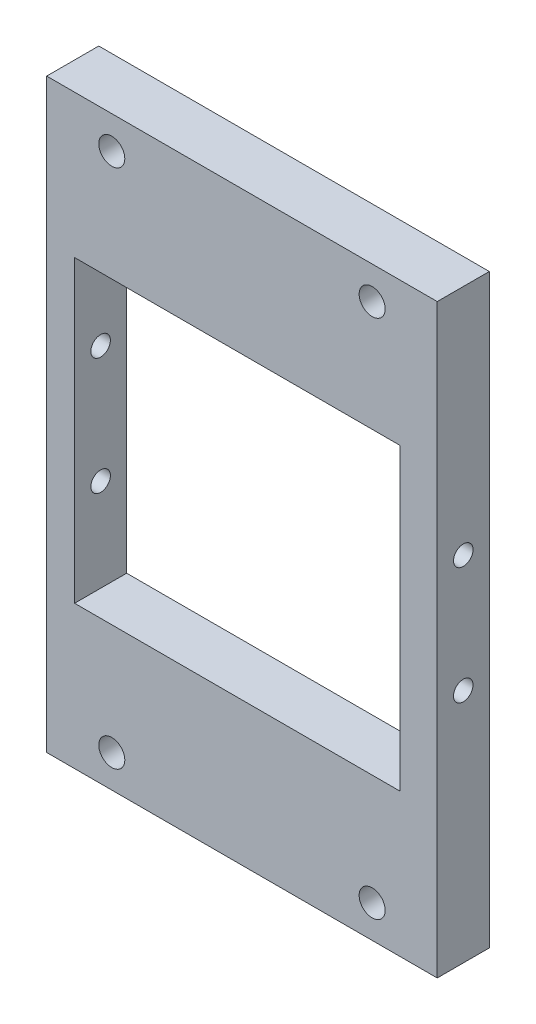
ISO-10303-21;
HEADER;
FILE_DESCRIPTION(('STEP AP214'),'2;1');
FILE_NAME('part.step','',(''),(''),'','','');
FILE_SCHEMA(('AUTOMOTIVE_DESIGN { 1 0 10303 214 1 1 1 1 }'));
ENDSEC;
DATA;
#1=APPLICATION_CONTEXT('core data for automotive mechanical design processes');
#2=APPLICATION_PROTOCOL_DEFINITION('international standard','automotive_design',2000,#1);
#3=PRODUCT_CONTEXT('',#1,'mechanical');
#4=PRODUCT('Part','Part','',(#3));
#5=PRODUCT_RELATED_PRODUCT_CATEGORY('part','',(#4));
#6=PRODUCT_DEFINITION_FORMATION('','',#4);
#7=PRODUCT_DEFINITION_CONTEXT('part definition',#1,'design');
#8=PRODUCT_DEFINITION('design','',#6,#7);
#9=PRODUCT_DEFINITION_SHAPE('','',#8);
#10=(LENGTH_UNIT() NAMED_UNIT(*) SI_UNIT(.MILLI.,.METRE.));
#11=(NAMED_UNIT(*) PLANE_ANGLE_UNIT() SI_UNIT($,.RADIAN.));
#12=(NAMED_UNIT(*) SI_UNIT($,.STERADIAN.) SOLID_ANGLE_UNIT());
#13=UNCERTAINTY_MEASURE_WITH_UNIT(LENGTH_MEASURE(1.E-05),#10,'distance_accuracy_value','');
#14=(GEOMETRIC_REPRESENTATION_CONTEXT(3) GLOBAL_UNCERTAINTY_ASSIGNED_CONTEXT((#13)) GLOBAL_UNIT_ASSIGNED_CONTEXT((#10,
#11,#12)) REPRESENTATION_CONTEXT('',''));
#15=CARTESIAN_POINT('',(0.,0.,0.));
#16=DIRECTION('',(0.,0.,1.));
#17=DIRECTION('',(1.,0.,0.));
#18=AXIS2_PLACEMENT_3D('',#15,#16,#17);
#19=CARTESIAN_POINT('',(-25.2870834420141,-45.,8.));
#20=DIRECTION('',(-1.,0.,0.));
#21=DIRECTION('',(0.,0.,1.));
#22=AXIS2_PLACEMENT_3D('',#19,#20,#21);
#23=PLANE('',#22);
#24=CARTESIAN_POINT('',(-25.2870834420141,9.25255391231961,4.));
#25=DIRECTION('',(-1.,0.,0.));
#26=DIRECTION('',(0.,0.,1.));
#27=AXIS2_PLACEMENT_3D('',#24,#25,#26);
#28=CIRCLE('',#27,1.5);
#29=CARTESIAN_POINT('',(-25.2870834420141,9.25255391231961,5.5));
#30=VERTEX_POINT('',#29);
#31=EDGE_CURVE('E245',#30,#30,#28,.T.);
#32=ORIENTED_EDGE('',*,*,#31,.T.);
#33=EDGE_LOOP('',(#32));
#34=FACE_BOUND('',#33,.T.);
#35=CARTESIAN_POINT('',(-25.2870834420141,-8.74744608768039,4.));
#36=DIRECTION('',(-1.,0.,0.));
#37=DIRECTION('',(0.,0.,1.));
#38=AXIS2_PLACEMENT_3D('',#35,#36,#37);
#39=CIRCLE('',#38,1.5);
#40=CARTESIAN_POINT('',(-25.2870834420141,-8.74744608768039,5.5));
#41=VERTEX_POINT('',#40);
#42=EDGE_CURVE('E161',#41,#41,#39,.T.);
#43=ORIENTED_EDGE('',*,*,#42,.T.);
#44=EDGE_LOOP('',(#43));
#45=FACE_BOUND('',#44,.T.);
#46=DIRECTION('',(0.,1.,0.));
#47=VECTOR('',#46,1.);
#48=CARTESIAN_POINT('',(-25.2870834420141,-45.,0.));
#49=LINE('',#48,#47);
#50=CARTESIAN_POINT('',(-25.2870834420141,-45.,0.));
#51=VERTEX_POINT('',#50);
#52=CARTESIAN_POINT('',(-25.2870834420141,45.,0.));
#53=VERTEX_POINT('',#52);
#54=EDGE_CURVE('E130',#51,#53,#49,.T.);
#55=ORIENTED_EDGE('',*,*,#54,.T.);
#56=DIRECTION('',(0.,0.,-1.));
#57=VECTOR('',#56,1.);
#58=CARTESIAN_POINT('',(-25.2870834420141,45.,8.));
#59=LINE('',#58,#57);
#60=CARTESIAN_POINT('',(-25.2870834420141,45.,8.));
#61=VERTEX_POINT('',#60);
#62=EDGE_CURVE('E11',#61,#53,#59,.T.);
#63=ORIENTED_EDGE('',*,*,#62,.F.);
#64=DIRECTION('',(0.,1.,0.));
#65=VECTOR('',#64,1.);
#66=CARTESIAN_POINT('',(-25.2870834420141,-45.,8.));
#67=LINE('',#66,#65);
#68=CARTESIAN_POINT('',(-25.2870834420141,-45.,8.));
#69=VERTEX_POINT('',#68);
#70=EDGE_CURVE('E132',#69,#61,#67,.T.);
#71=ORIENTED_EDGE('',*,*,#70,.F.);
#72=DIRECTION('',(0.,0.,-1.));
#73=VECTOR('',#72,1.);
#74=CARTESIAN_POINT('',(-25.2870834420141,-45.,8.));
#75=LINE('',#74,#73);
#76=EDGE_CURVE('E144',#69,#51,#75,.T.);
#77=ORIENTED_EDGE('',*,*,#76,.T.);
#78=EDGE_LOOP('',(#55,#63,#71,#77));
#79=FACE_BOUND('',#78,.T.);
#80=ADVANCED_FACE('F32',(#34,#45,#79),#23,.F.);
#81=CARTESIAN_POINT('',(-25.2870834420141,45.,8.));
#82=DIRECTION('',(0.,-1.,0.));
#83=DIRECTION('',(1.,0.,0.));
#84=AXIS2_PLACEMENT_3D('',#81,#82,#83);
#85=PLANE('',#84);
#86=DIRECTION('',(-1.,0.,0.));
#87=VECTOR('',#86,1.);
#88=CARTESIAN_POINT('',(-25.2870834420141,45.,0.));
#89=LINE('',#88,#87);
#90=CARTESIAN_POINT('',(-85.2870834420141,45.,0.));
#91=VERTEX_POINT('',#90);
#92=EDGE_CURVE('E147',#53,#91,#89,.T.);
#93=ORIENTED_EDGE('',*,*,#92,.T.);
#94=DIRECTION('',(0.,0.,-1.));
#95=VECTOR('',#94,1.);
#96=CARTESIAN_POINT('',(-85.2870834420141,45.,8.));
#97=LINE('',#96,#95);
#98=CARTESIAN_POINT('',(-85.2870834420141,45.,8.));
#99=VERTEX_POINT('',#98);
#100=EDGE_CURVE('E40',#99,#91,#97,.T.);
#101=ORIENTED_EDGE('',*,*,#100,.F.);
#102=DIRECTION('',(-1.,0.,0.));
#103=VECTOR('',#102,1.);
#104=CARTESIAN_POINT('',(-25.2870834420141,45.,8.));
#105=LINE('',#104,#103);
#106=EDGE_CURVE('E135',#61,#99,#105,.T.);
#107=ORIENTED_EDGE('',*,*,#106,.F.);
#108=ORIENTED_EDGE('',*,*,#62,.T.);
#109=EDGE_LOOP('',(#93,#101,#107,#108));
#110=FACE_BOUND('',#109,.T.);
#111=ADVANCED_FACE('F228',(#110),#85,.F.);
#112=CARTESIAN_POINT('',(-85.2870834420141,-45.,8.));
#113=DIRECTION('',(-1.,0.,0.));
#114=DIRECTION('',(0.,0.,1.));
#115=AXIS2_PLACEMENT_3D('',#112,#113,#114);
#116=PLANE('',#115);
#117=CARTESIAN_POINT('',(-85.2870834420141,9.25255391231961,4.));
#118=DIRECTION('',(-1.,0.,0.));
#119=DIRECTION('',(0.,0.,1.));
#120=AXIS2_PLACEMENT_3D('',#117,#118,#119);
#121=CIRCLE('',#120,1.5);
#122=CARTESIAN_POINT('',(-85.2870834420141,9.25255391231961,5.5));
#123=VERTEX_POINT('',#122);
#124=EDGE_CURVE('E247',#123,#123,#121,.T.);
#125=ORIENTED_EDGE('',*,*,#124,.F.);
#126=EDGE_LOOP('',(#125));
#127=FACE_BOUND('',#126,.T.);
#128=CARTESIAN_POINT('',(-85.2870834420141,-8.74744608768039,4.));
#129=DIRECTION('',(-1.,0.,0.));
#130=DIRECTION('',(0.,0.,1.));
#131=AXIS2_PLACEMENT_3D('',#128,#129,#130);
#132=CIRCLE('',#131,1.5);
#133=CARTESIAN_POINT('',(-85.2870834420141,-8.74744608768039,5.5));
#134=VERTEX_POINT('',#133);
#135=EDGE_CURVE('E168',#134,#134,#132,.T.);
#136=ORIENTED_EDGE('',*,*,#135,.F.);
#137=EDGE_LOOP('',(#136));
#138=FACE_BOUND('',#137,.T.);
#139=DIRECTION('',(0.,1.,0.));
#140=VECTOR('',#139,1.);
#141=CARTESIAN_POINT('',(-85.2870834420141,-45.,0.));
#142=LINE('',#141,#140);
#143=CARTESIAN_POINT('',(-85.2870834420141,-45.,0.));
#144=VERTEX_POINT('',#143);
#145=EDGE_CURVE('E150',#144,#91,#142,.T.);
#146=ORIENTED_EDGE('',*,*,#145,.F.);
#147=DIRECTION('',(0.,0.,-1.));
#148=VECTOR('',#147,1.);
#149=CARTESIAN_POINT('',(-85.2870834420141,-45.,8.));
#150=LINE('',#149,#148);
#151=CARTESIAN_POINT('',(-85.2870834420141,-45.,8.));
#152=VERTEX_POINT('',#151);
#153=EDGE_CURVE('E156',#152,#144,#150,.T.);
#154=ORIENTED_EDGE('',*,*,#153,.F.);
#155=DIRECTION('',(0.,1.,0.));
#156=VECTOR('',#155,1.);
#157=CARTESIAN_POINT('',(-85.2870834420141,-45.,8.));
#158=LINE('',#157,#156);
#159=EDGE_CURVE('E138',#152,#99,#158,.T.);
#160=ORIENTED_EDGE('',*,*,#159,.T.);
#161=ORIENTED_EDGE('',*,*,#100,.T.);
#162=EDGE_LOOP('',(#146,#154,#160,#161));
#163=FACE_BOUND('',#162,.T.);
#164=ADVANCED_FACE('F225',(#127,#138,#163),#116,.T.);
#165=CARTESIAN_POINT('',(-25.2870834420141,-45.,8.));
#166=DIRECTION('',(0.,-1.,0.));
#167=DIRECTION('',(1.,0.,0.));
#168=AXIS2_PLACEMENT_3D('',#165,#166,#167);
#169=PLANE('',#168);
#170=DIRECTION('',(-1.,0.,0.));
#171=VECTOR('',#170,1.);
#172=CARTESIAN_POINT('',(-25.2870834420141,-45.,0.));
#173=LINE('',#172,#171);
#174=EDGE_CURVE('E136',#51,#144,#173,.T.);
#175=ORIENTED_EDGE('',*,*,#174,.F.);
#176=ORIENTED_EDGE('',*,*,#76,.F.);
#177=DIRECTION('',(-1.,0.,0.));
#178=VECTOR('',#177,1.);
#179=CARTESIAN_POINT('',(-25.2870834420141,-45.,8.));
#180=LINE('',#179,#178);
#181=EDGE_CURVE('E141',#69,#152,#180,.T.);
#182=ORIENTED_EDGE('',*,*,#181,.T.);
#183=ORIENTED_EDGE('',*,*,#153,.T.);
#184=EDGE_LOOP('',(#175,#176,#182,#183));
#185=FACE_BOUND('',#184,.T.);
#186=ADVANCED_FACE('F219',(#185),#169,.T.);
#187=CARTESIAN_POINT('',(0.,0.,8.));
#188=DIRECTION('',(0.,0.,1.));
#189=DIRECTION('',(1.,0.,0.));
#190=AXIS2_PLACEMENT_3D('',#187,#188,#189);
#191=PLANE('',#190);
#192=CARTESIAN_POINT('',(-35.2870834420141,40.,8.));
#193=DIRECTION('',(0.,0.,-1.));
#194=DIRECTION('',(1.,0.,0.));
#195=AXIS2_PLACEMENT_3D('',#192,#193,#194);
#196=CIRCLE('',#195,2.);
#197=CARTESIAN_POINT('',(-33.2870834420141,40.,8.));
#198=VERTEX_POINT('',#197);
#199=EDGE_CURVE('E165',#198,#198,#196,.T.);
#200=ORIENTED_EDGE('',*,*,#199,.T.);
#201=EDGE_LOOP('',(#200));
#202=FACE_BOUND('',#201,.T.);
#203=CARTESIAN_POINT('',(-75.2870834420141,40.,8.));
#204=DIRECTION('',(0.,0.,-1.));
#205=DIRECTION('',(1.,0.,0.));
#206=AXIS2_PLACEMENT_3D('',#203,#204,#205);
#207=CIRCLE('',#206,2.);
#208=CARTESIAN_POINT('',(-73.2870834420141,40.,8.));
#209=VERTEX_POINT('',#208);
#210=EDGE_CURVE('E181',#209,#209,#207,.T.);
#211=ORIENTED_EDGE('',*,*,#210,.T.);
#212=EDGE_LOOP('',(#211));
#213=FACE_BOUND('',#212,.T.);
#214=CARTESIAN_POINT('',(-35.2870834420141,-40.,8.));
#215=DIRECTION('',(0.,0.,1.));
#216=DIRECTION('',(1.,0.,0.));
#217=AXIS2_PLACEMENT_3D('',#214,#215,#216);
#218=CIRCLE('',#217,2.);
#219=CARTESIAN_POINT('',(-33.2870834420141,-40.,8.));
#220=VERTEX_POINT('',#219);
#221=EDGE_CURVE('E187',#220,#220,#218,.T.);
#222=ORIENTED_EDGE('',*,*,#221,.F.);
#223=EDGE_LOOP('',(#222));
#224=FACE_BOUND('',#223,.T.);
#225=CARTESIAN_POINT('',(-75.2870834420141,-40.,8.));
#226=DIRECTION('',(0.,0.,1.));
#227=DIRECTION('',(1.,0.,0.));
#228=AXIS2_PLACEMENT_3D('',#225,#226,#227);
#229=CIRCLE('',#228,2.);
#230=CARTESIAN_POINT('',(-73.2870834420141,-40.,8.));
#231=VERTEX_POINT('',#230);
#232=EDGE_CURVE('E193',#231,#231,#229,.T.);
#233=ORIENTED_EDGE('',*,*,#232,.F.);
#234=EDGE_LOOP('',(#233));
#235=FACE_BOUND('',#234,.T.);
#236=DIRECTION('',(0.,-1.,0.));
#237=VECTOR('',#236,1.);
#238=CARTESIAN_POINT('',(-81.,17.,8.));
#239=LINE('',#238,#237);
#240=CARTESIAN_POINT('',(-81.,23.,8.));
#241=VERTEX_POINT('',#240);
#242=CARTESIAN_POINT('',(-81.,-23.,8.));
#243=VERTEX_POINT('',#242);
#244=EDGE_CURVE('E48',#241,#243,#239,.T.);
#245=ORIENTED_EDGE('',*,*,#244,.F.);
#246=DIRECTION('',(-1.,0.,0.));
#247=VECTOR('',#246,1.);
#248=CARTESIAN_POINT('',(-31.,23.,8.));
#249=LINE('',#248,#247);
#250=CARTESIAN_POINT('',(-31.,23.,8.));
#251=VERTEX_POINT('',#250);
#252=EDGE_CURVE('E118',#251,#241,#249,.T.);
#253=ORIENTED_EDGE('',*,*,#252,.F.);
#254=DIRECTION('',(0.,1.,0.));
#255=VECTOR('',#254,1.);
#256=CARTESIAN_POINT('',(-31.,17.,8.));
#257=LINE('',#256,#255);
#258=CARTESIAN_POINT('',(-31.,-23.,8.));
#259=VERTEX_POINT('',#258);
#260=EDGE_CURVE('E101',#259,#251,#257,.T.);
#261=ORIENTED_EDGE('',*,*,#260,.F.);
#262=DIRECTION('',(1.,0.,0.));
#263=VECTOR('',#262,1.);
#264=CARTESIAN_POINT('',(-31.,-23.,8.));
#265=LINE('',#264,#263);
#266=EDGE_CURVE('E110',#243,#259,#265,.T.);
#267=ORIENTED_EDGE('',*,*,#266,.F.);
#268=EDGE_LOOP('',(#245,#253,#261,#267));
#269=FACE_BOUND('',#268,.T.);
#270=ORIENTED_EDGE('',*,*,#70,.T.);
#271=ORIENTED_EDGE('',*,*,#106,.T.);
#272=ORIENTED_EDGE('',*,*,#159,.F.);
#273=ORIENTED_EDGE('',*,*,#181,.F.);
#274=EDGE_LOOP('',(#270,#271,#272,#273));
#275=FACE_BOUND('',#274,.T.);
#276=ADVANCED_FACE('F115',(#202,#213,#224,#235,#269,#275),#191,.T.);
#277=CARTESIAN_POINT('',(0.,0.,0.));
#278=DIRECTION('',(0.,0.,1.));
#279=DIRECTION('',(1.,0.,0.));
#280=AXIS2_PLACEMENT_3D('',#277,#278,#279);
#281=PLANE('',#280);
#282=CARTESIAN_POINT('',(-35.2870834420141,40.,0.));
#283=DIRECTION('',(0.,0.,-1.));
#284=DIRECTION('',(1.,0.,0.));
#285=AXIS2_PLACEMENT_3D('',#282,#283,#284);
#286=CIRCLE('',#285,2.);
#287=CARTESIAN_POINT('',(-33.2870834420141,40.,0.));
#288=VERTEX_POINT('',#287);
#289=EDGE_CURVE('E178',#288,#288,#286,.T.);
#290=ORIENTED_EDGE('',*,*,#289,.F.);
#291=EDGE_LOOP('',(#290));
#292=FACE_BOUND('',#291,.T.);
#293=CARTESIAN_POINT('',(-75.2870834420141,40.,0.));
#294=DIRECTION('',(0.,0.,-1.));
#295=DIRECTION('',(1.,0.,0.));
#296=AXIS2_PLACEMENT_3D('',#293,#294,#295);
#297=CIRCLE('',#296,2.);
#298=CARTESIAN_POINT('',(-73.2870834420141,40.,0.));
#299=VERTEX_POINT('',#298);
#300=EDGE_CURVE('E184',#299,#299,#297,.T.);
#301=ORIENTED_EDGE('',*,*,#300,.F.);
#302=EDGE_LOOP('',(#301));
#303=FACE_BOUND('',#302,.T.);
#304=CARTESIAN_POINT('',(-35.2870834420141,-40.,0.));
#305=DIRECTION('',(0.,0.,1.));
#306=DIRECTION('',(1.,0.,0.));
#307=AXIS2_PLACEMENT_3D('',#304,#305,#306);
#308=CIRCLE('',#307,2.);
#309=CARTESIAN_POINT('',(-33.2870834420141,-40.,0.));
#310=VERTEX_POINT('',#309);
#311=EDGE_CURVE('E190',#310,#310,#308,.T.);
#312=ORIENTED_EDGE('',*,*,#311,.T.);
#313=EDGE_LOOP('',(#312));
#314=FACE_BOUND('',#313,.T.);
#315=CARTESIAN_POINT('',(-75.2870834420141,-40.,0.));
#316=DIRECTION('',(0.,0.,1.));
#317=DIRECTION('',(1.,0.,0.));
#318=AXIS2_PLACEMENT_3D('',#315,#316,#317);
#319=CIRCLE('',#318,2.);
#320=CARTESIAN_POINT('',(-73.2870834420141,-40.,0.));
#321=VERTEX_POINT('',#320);
#322=EDGE_CURVE('E113',#321,#321,#319,.T.);
#323=ORIENTED_EDGE('',*,*,#322,.T.);
#324=EDGE_LOOP('',(#323));
#325=FACE_BOUND('',#324,.T.);
#326=DIRECTION('',(1.,0.,0.));
#327=VECTOR('',#326,1.);
#328=CARTESIAN_POINT('',(-31.,23.,0.));
#329=LINE('',#328,#327);
#330=CARTESIAN_POINT('',(-81.,23.,0.));
#331=VERTEX_POINT('',#330);
#332=CARTESIAN_POINT('',(-31.,23.,0.));
#333=VERTEX_POINT('',#332);
#334=EDGE_CURVE('E201',#331,#333,#329,.T.);
#335=ORIENTED_EDGE('',*,*,#334,.F.);
#336=DIRECTION('',(0.,1.,0.));
#337=VECTOR('',#336,1.);
#338=CARTESIAN_POINT('',(-81.,17.,0.));
#339=LINE('',#338,#337);
#340=CARTESIAN_POINT('',(-81.,-23.,0.));
#341=VERTEX_POINT('',#340);
#342=EDGE_CURVE('E131',#341,#331,#339,.T.);
#343=ORIENTED_EDGE('',*,*,#342,.F.);
#344=DIRECTION('',(-1.,0.,0.));
#345=VECTOR('',#344,1.);
#346=CARTESIAN_POINT('',(-31.,-23.,0.));
#347=LINE('',#346,#345);
#348=CARTESIAN_POINT('',(-31.,-23.,0.));
#349=VERTEX_POINT('',#348);
#350=EDGE_CURVE('E128',#349,#341,#347,.T.);
#351=ORIENTED_EDGE('',*,*,#350,.F.);
#352=DIRECTION('',(0.,-1.,0.));
#353=VECTOR('',#352,1.);
#354=CARTESIAN_POINT('',(-31.,17.,0.));
#355=LINE('',#354,#353);
#356=EDGE_CURVE('E104',#333,#349,#355,.T.);
#357=ORIENTED_EDGE('',*,*,#356,.F.);
#358=EDGE_LOOP('',(#335,#343,#351,#357));
#359=FACE_BOUND('',#358,.T.);
#360=ORIENTED_EDGE('',*,*,#54,.F.);
#361=ORIENTED_EDGE('',*,*,#174,.T.);
#362=ORIENTED_EDGE('',*,*,#145,.T.);
#363=ORIENTED_EDGE('',*,*,#92,.F.);
#364=EDGE_LOOP('',(#360,#361,#362,#363));
#365=FACE_BOUND('',#364,.T.);
#366=ADVANCED_FACE('F209',(#292,#303,#314,#325,#359,#365),#281,.F.);
#367=CARTESIAN_POINT('',(-81.,17.,-67.9411510058521));
#368=DIRECTION('',(-1.,0.,0.));
#369=DIRECTION('',(0.,-1.,0.));
#370=AXIS2_PLACEMENT_3D('',#367,#368,#369);
#371=PLANE('',#370);
#372=CARTESIAN_POINT('',(-81.,9.25255391231961,4.));
#373=DIRECTION('',(-1.,0.,0.));
#374=DIRECTION('',(0.,-1.,0.));
#375=AXIS2_PLACEMENT_3D('',#372,#373,#374);
#376=CIRCLE('',#375,1.5);
#377=CARTESIAN_POINT('',(-81.,7.75255391231961,4.));
#378=VERTEX_POINT('',#377);
#379=EDGE_CURVE('E173',#378,#378,#376,.T.);
#380=ORIENTED_EDGE('',*,*,#379,.T.);
#381=EDGE_LOOP('',(#380));
#382=FACE_BOUND('',#381,.T.);
#383=CARTESIAN_POINT('',(-81.0000000000001,-8.74744608768039,4.));
#384=DIRECTION('',(-1.,0.,0.));
#385=DIRECTION('',(0.,-1.,0.));
#386=AXIS2_PLACEMENT_3D('',#383,#384,#385);
#387=CIRCLE('',#386,1.5);
#388=CARTESIAN_POINT('',(-81.0000000000001,-10.2474460876804,4.));
#389=VERTEX_POINT('',#388);
#390=EDGE_CURVE('E160',#389,#389,#387,.T.);
#391=ORIENTED_EDGE('',*,*,#390,.T.);
#392=EDGE_LOOP('',(#391));
#393=FACE_BOUND('',#392,.T.);
#394=ORIENTED_EDGE('',*,*,#342,.T.);
#395=DIRECTION('',(0.,0.,1.));
#396=VECTOR('',#395,1.);
#397=CARTESIAN_POINT('',(-81.,23.,-67.9411510058521));
#398=LINE('',#397,#396);
#399=EDGE_CURVE('E124',#331,#241,#398,.T.);
#400=ORIENTED_EDGE('',*,*,#399,.T.);
#401=ORIENTED_EDGE('',*,*,#244,.T.);
#402=DIRECTION('',(0.,0.,1.));
#403=VECTOR('',#402,1.);
#404=CARTESIAN_POINT('',(-81.,-23.,-67.9411510058521));
#405=LINE('',#404,#403);
#406=EDGE_CURVE('E107',#341,#243,#405,.T.);
#407=ORIENTED_EDGE('',*,*,#406,.F.);
#408=EDGE_LOOP('',(#394,#400,#401,#407));
#409=FACE_BOUND('',#408,.T.);
#410=ADVANCED_FACE('F204',(#382,#393,#409),#371,.F.);
#411=CARTESIAN_POINT('',(-31.,23.,-67.9411510058521));
#412=DIRECTION('',(0.,1.,0.));
#413=DIRECTION('',(0.,0.,1.));
#414=AXIS2_PLACEMENT_3D('',#411,#412,#413);
#415=PLANE('',#414);
#416=ORIENTED_EDGE('',*,*,#334,.T.);
#417=DIRECTION('',(0.,0.,1.));
#418=VECTOR('',#417,1.);
#419=CARTESIAN_POINT('',(-31.,23.,-67.9411510058521));
#420=LINE('',#419,#418);
#421=EDGE_CURVE('E106',#333,#251,#420,.T.);
#422=ORIENTED_EDGE('',*,*,#421,.T.);
#423=ORIENTED_EDGE('',*,*,#252,.T.);
#424=ORIENTED_EDGE('',*,*,#399,.F.);
#425=EDGE_LOOP('',(#416,#422,#423,#424));
#426=FACE_BOUND('',#425,.T.);
#427=ADVANCED_FACE('F208',(#426),#415,.F.);
#428=CARTESIAN_POINT('',(-31.,17.,-67.9411510058521));
#429=DIRECTION('',(1.,0.,0.));
#430=DIRECTION('',(0.,0.,-1.));
#431=AXIS2_PLACEMENT_3D('',#428,#429,#430);
#432=PLANE('',#431);
#433=CARTESIAN_POINT('',(-31.,9.25255391231961,4.));
#434=DIRECTION('',(1.,0.,0.));
#435=DIRECTION('',(0.,0.,-1.));
#436=AXIS2_PLACEMENT_3D('',#433,#434,#435);
#437=CIRCLE('',#436,1.5);
#438=CARTESIAN_POINT('',(-31.,9.25255391231961,2.5));
#439=VERTEX_POINT('',#438);
#440=EDGE_CURVE('E35',#439,#439,#437,.T.);
#441=ORIENTED_EDGE('',*,*,#440,.T.);
#442=EDGE_LOOP('',(#441));
#443=FACE_BOUND('',#442,.T.);
#444=CARTESIAN_POINT('',(-31.,-8.74744608768039,4.));
#445=DIRECTION('',(1.,0.,0.));
#446=DIRECTION('',(0.,0.,-1.));
#447=AXIS2_PLACEMENT_3D('',#444,#445,#446);
#448=CIRCLE('',#447,1.5);
#449=CARTESIAN_POINT('',(-31.,-8.74744608768039,2.5));
#450=VERTEX_POINT('',#449);
#451=EDGE_CURVE('E158',#450,#450,#448,.T.);
#452=ORIENTED_EDGE('',*,*,#451,.T.);
#453=EDGE_LOOP('',(#452));
#454=FACE_BOUND('',#453,.T.);
#455=ORIENTED_EDGE('',*,*,#356,.T.);
#456=DIRECTION('',(0.,0.,1.));
#457=VECTOR('',#456,1.);
#458=CARTESIAN_POINT('',(-31.,-23.,-67.9411510058521));
#459=LINE('',#458,#457);
#460=EDGE_CURVE('E56',#349,#259,#459,.T.);
#461=ORIENTED_EDGE('',*,*,#460,.T.);
#462=ORIENTED_EDGE('',*,*,#260,.T.);
#463=ORIENTED_EDGE('',*,*,#421,.F.);
#464=EDGE_LOOP('',(#455,#461,#462,#463));
#465=FACE_BOUND('',#464,.T.);
#466=ADVANCED_FACE('F98',(#443,#454,#465),#432,.F.);
#467=CARTESIAN_POINT('',(-31.,-23.,-67.9411510058521));
#468=DIRECTION('',(0.,-1.,0.));
#469=DIRECTION('',(0.,0.,-1.));
#470=AXIS2_PLACEMENT_3D('',#467,#468,#469);
#471=PLANE('',#470);
#472=ORIENTED_EDGE('',*,*,#350,.T.);
#473=ORIENTED_EDGE('',*,*,#406,.T.);
#474=ORIENTED_EDGE('',*,*,#266,.T.);
#475=ORIENTED_EDGE('',*,*,#460,.F.);
#476=EDGE_LOOP('',(#472,#473,#474,#475));
#477=FACE_BOUND('',#476,.T.);
#478=ADVANCED_FACE('F111',(#477),#471,.F.);
#479=CARTESIAN_POINT('',(-75.2870834420141,-40.,0.));
#480=DIRECTION('',(0.,0.,1.));
#481=DIRECTION('',(1.,0.,0.));
#482=AXIS2_PLACEMENT_3D('',#479,#480,#481);
#483=CYLINDRICAL_SURFACE('',#482,2.);
#484=ORIENTED_EDGE('',*,*,#322,.F.);
#485=EDGE_LOOP('',(#484));
#486=FACE_BOUND('',#485,.T.);
#487=ORIENTED_EDGE('',*,*,#232,.T.);
#488=EDGE_LOOP('',(#487));
#489=FACE_BOUND('',#488,.T.);
#490=ADVANCED_FACE('F278',(#486,#489),#483,.F.);
#491=CARTESIAN_POINT('',(-35.2870834420141,-40.,0.));
#492=DIRECTION('',(0.,0.,1.));
#493=DIRECTION('',(1.,0.,0.));
#494=AXIS2_PLACEMENT_3D('',#491,#492,#493);
#495=CYLINDRICAL_SURFACE('',#494,2.);
#496=ORIENTED_EDGE('',*,*,#311,.F.);
#497=EDGE_LOOP('',(#496));
#498=FACE_BOUND('',#497,.T.);
#499=ORIENTED_EDGE('',*,*,#221,.T.);
#500=EDGE_LOOP('',(#499));
#501=FACE_BOUND('',#500,.T.);
#502=ADVANCED_FACE('F287',(#498,#501),#495,.F.);
#503=CARTESIAN_POINT('',(-75.2870834420141,40.,0.));
#504=DIRECTION('',(0.,0.,1.));
#505=DIRECTION('',(1.,0.,0.));
#506=AXIS2_PLACEMENT_3D('',#503,#504,#505);
#507=CYLINDRICAL_SURFACE('',#506,2.);
#508=ORIENTED_EDGE('',*,*,#300,.T.);
#509=EDGE_LOOP('',(#508));
#510=FACE_BOUND('',#509,.T.);
#511=ORIENTED_EDGE('',*,*,#210,.F.);
#512=EDGE_LOOP('',(#511));
#513=FACE_BOUND('',#512,.T.);
#514=ADVANCED_FACE('F292',(#510,#513),#507,.F.);
#515=CARTESIAN_POINT('',(-35.2870834420141,40.,0.));
#516=DIRECTION('',(0.,0.,1.));
#517=DIRECTION('',(1.,0.,0.));
#518=AXIS2_PLACEMENT_3D('',#515,#516,#517);
#519=CYLINDRICAL_SURFACE('',#518,2.);
#520=ORIENTED_EDGE('',*,*,#289,.T.);
#521=EDGE_LOOP('',(#520));
#522=FACE_BOUND('',#521,.T.);
#523=ORIENTED_EDGE('',*,*,#199,.F.);
#524=EDGE_LOOP('',(#523));
#525=FACE_BOUND('',#524,.T.);
#526=ADVANCED_FACE('F302',(#522,#525),#519,.F.);
#527=CARTESIAN_POINT('',(-25.2870834420141,-8.74744608768039,4.));
#528=DIRECTION('',(-1.,0.,0.));
#529=DIRECTION('',(0.,0.,1.));
#530=AXIS2_PLACEMENT_3D('',#527,#528,#529);
#531=CYLINDRICAL_SURFACE('',#530,1.5);
#532=ORIENTED_EDGE('',*,*,#42,.F.);
#533=EDGE_LOOP('',(#532));
#534=FACE_BOUND('',#533,.T.);
#535=ORIENTED_EDGE('',*,*,#451,.F.);
#536=EDGE_LOOP('',(#535));
#537=FACE_BOUND('',#536,.T.);
#538=ADVANCED_FACE('F265',(#534,#537),#531,.F.);
#539=ORIENTED_EDGE('',*,*,#135,.T.);
#540=EDGE_LOOP('',(#539));
#541=FACE_BOUND('',#540,.T.);
#542=ORIENTED_EDGE('',*,*,#390,.F.);
#543=EDGE_LOOP('',(#542));
#544=FACE_BOUND('',#543,.T.);
#545=ADVANCED_FACE('F261',(#541,#544),#531,.F.);
#546=CARTESIAN_POINT('',(-25.2870834420141,9.25255391231961,4.));
#547=DIRECTION('',(-1.,0.,0.));
#548=DIRECTION('',(0.,0.,1.));
#549=AXIS2_PLACEMENT_3D('',#546,#547,#548);
#550=CYLINDRICAL_SURFACE('',#549,1.5);
#551=ORIENTED_EDGE('',*,*,#31,.F.);
#552=EDGE_LOOP('',(#551));
#553=FACE_BOUND('',#552,.T.);
#554=ORIENTED_EDGE('',*,*,#440,.F.);
#555=EDGE_LOOP('',(#554));
#556=FACE_BOUND('',#555,.T.);
#557=ADVANCED_FACE('F264',(#553,#556),#550,.F.);
#558=ORIENTED_EDGE('',*,*,#124,.T.);
#559=EDGE_LOOP('',(#558));
#560=FACE_BOUND('',#559,.T.);
#561=ORIENTED_EDGE('',*,*,#379,.F.);
#562=EDGE_LOOP('',(#561));
#563=FACE_BOUND('',#562,.T.);
#564=ADVANCED_FACE('F253',(#560,#563),#550,.F.);
#565=CLOSED_SHELL('',(#80,#111,#164,#186,#276,#366,#410,#427,#466,#478,#490,#502,#514,#526,#538,
#545,#557,#564));
#566=MANIFOLD_SOLID_BREP('B2',#565);
#567=ADVANCED_BREP_SHAPE_REPRESENTATION('',(#18,#566),#14);
#568=SHAPE_DEFINITION_REPRESENTATION(#9,#567);
ENDSEC;
END-ISO-10303-21;
